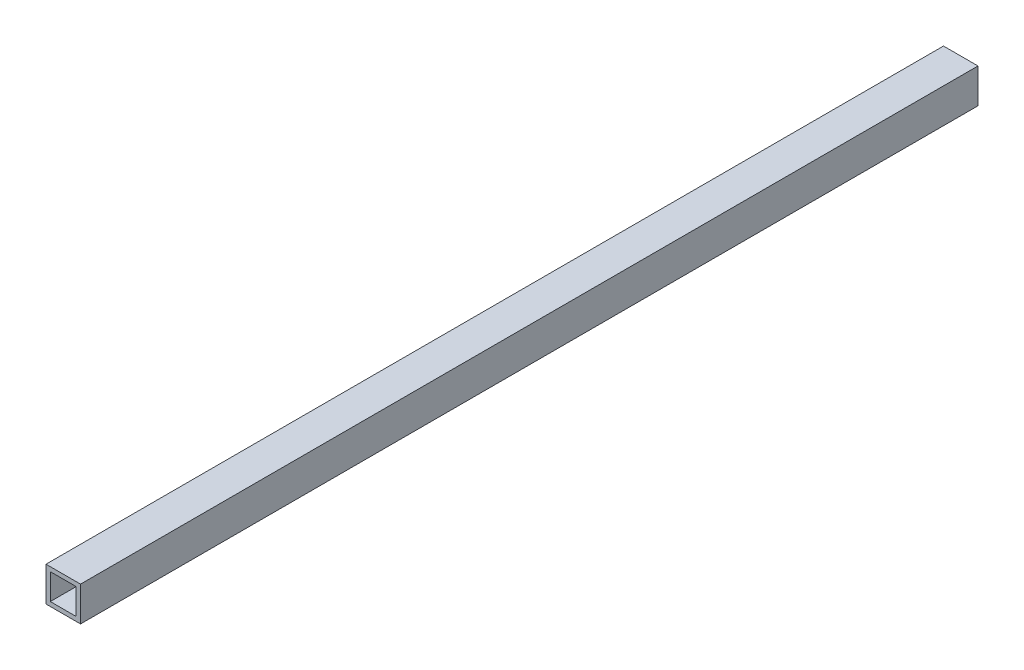
ISO-10303-21;
HEADER;
FILE_DESCRIPTION(('STEP AP214'),'2;1');
FILE_NAME('part.step','',(''),(''),'','','');
FILE_SCHEMA(('AUTOMOTIVE_DESIGN { 1 0 10303 214 1 1 1 1 }'));
ENDSEC;
DATA;
#1=APPLICATION_CONTEXT('core data for automotive mechanical design processes');
#2=APPLICATION_PROTOCOL_DEFINITION('international standard','automotive_design',2000,#1);
#3=PRODUCT_CONTEXT('',#1,'mechanical');
#4=PRODUCT('Part','Part','',(#3));
#5=PRODUCT_RELATED_PRODUCT_CATEGORY('part','',(#4));
#6=PRODUCT_DEFINITION_FORMATION('','',#4);
#7=PRODUCT_DEFINITION_CONTEXT('part definition',#1,'design');
#8=PRODUCT_DEFINITION('design','',#6,#7);
#9=PRODUCT_DEFINITION_SHAPE('','',#8);
#10=(LENGTH_UNIT() NAMED_UNIT(*) SI_UNIT(.MILLI.,.METRE.));
#11=(NAMED_UNIT(*) PLANE_ANGLE_UNIT() SI_UNIT($,.RADIAN.));
#12=(NAMED_UNIT(*) SI_UNIT($,.STERADIAN.) SOLID_ANGLE_UNIT());
#13=UNCERTAINTY_MEASURE_WITH_UNIT(LENGTH_MEASURE(1.E-05),#10,'distance_accuracy_value','');
#14=(GEOMETRIC_REPRESENTATION_CONTEXT(3) GLOBAL_UNCERTAINTY_ASSIGNED_CONTEXT((#13)) GLOBAL_UNIT_ASSIGNED_CONTEXT((#10,
#11,#12)) REPRESENTATION_CONTEXT('',''));
#15=CARTESIAN_POINT('',(0.,0.,0.));
#16=DIRECTION('',(0.,0.,1.));
#17=DIRECTION('',(1.,0.,0.));
#18=AXIS2_PLACEMENT_3D('',#15,#16,#17);
#19=CARTESIAN_POINT('',(0.,0.,330.2));
#20=DIRECTION('',(0.,0.,1.));
#21=DIRECTION('',(1.,0.,0.));
#22=AXIS2_PLACEMENT_3D('',#19,#20,#21);
#23=PLANE('',#22);
#24=DIRECTION('',(0.,-1.,0.));
#25=VECTOR('',#24,1.);
#26=CARTESIAN_POINT('',(-12.7,-12.7,330.2));
#27=LINE('',#26,#25);
#28=CARTESIAN_POINT('',(-12.7,12.7,330.2));
#29=VERTEX_POINT('',#28);
#30=CARTESIAN_POINT('',(-12.7,-12.7,330.2));
#31=VERTEX_POINT('',#30);
#32=EDGE_CURVE('E110',#29,#31,#27,.T.);
#33=ORIENTED_EDGE('',*,*,#32,.T.);
#34=DIRECTION('',(1.,0.,0.));
#35=VECTOR('',#34,1.);
#36=CARTESIAN_POINT('',(12.7,-12.7,330.2));
#37=LINE('',#36,#35);
#38=CARTESIAN_POINT('',(12.7,-12.7,330.2));
#39=VERTEX_POINT('',#38);
#40=EDGE_CURVE('E153',#31,#39,#37,.T.);
#41=ORIENTED_EDGE('',*,*,#40,.T.);
#42=DIRECTION('',(0.,1.,0.));
#43=VECTOR('',#42,1.);
#44=CARTESIAN_POINT('',(12.7,-12.7,330.2));
#45=LINE('',#44,#43);
#46=CARTESIAN_POINT('',(12.7,12.7,330.2));
#47=VERTEX_POINT('',#46);
#48=EDGE_CURVE('E155',#39,#47,#45,.T.);
#49=ORIENTED_EDGE('',*,*,#48,.T.);
#50=DIRECTION('',(-1.,0.,0.));
#51=VECTOR('',#50,1.);
#52=CARTESIAN_POINT('',(12.7,12.7,330.2));
#53=LINE('',#52,#51);
#54=EDGE_CURVE('E57',#47,#29,#53,.T.);
#55=ORIENTED_EDGE('',*,*,#54,.T.);
#56=EDGE_LOOP('',(#33,#41,#49,#55));
#57=FACE_BOUND('',#56,.T.);
#58=DIRECTION('',(1.,0.,0.));
#59=VECTOR('',#58,1.);
#60=CARTESIAN_POINT('',(9.525,-9.525,330.2));
#61=LINE('',#60,#59);
#62=CARTESIAN_POINT('',(-9.52499999999999,-9.525,330.2));
#63=VERTEX_POINT('',#62);
#64=CARTESIAN_POINT('',(9.525,-9.525,330.2));
#65=VERTEX_POINT('',#64);
#66=EDGE_CURVE('E142',#63,#65,#61,.T.);
#67=ORIENTED_EDGE('',*,*,#66,.F.);
#68=DIRECTION('',(0.,-1.,0.));
#69=VECTOR('',#68,1.);
#70=CARTESIAN_POINT('',(-9.52499999999999,-9.525,330.2));
#71=LINE('',#70,#69);
#72=CARTESIAN_POINT('',(-9.52499999999999,9.525,330.2));
#73=VERTEX_POINT('',#72);
#74=EDGE_CURVE('E107',#73,#63,#71,.T.);
#75=ORIENTED_EDGE('',*,*,#74,.F.);
#76=DIRECTION('',(-1.,0.,0.));
#77=VECTOR('',#76,1.);
#78=CARTESIAN_POINT('',(9.525,9.525,330.2));
#79=LINE('',#78,#77);
#80=CARTESIAN_POINT('',(9.525,9.525,330.2));
#81=VERTEX_POINT('',#80);
#82=EDGE_CURVE('E146',#81,#73,#79,.T.);
#83=ORIENTED_EDGE('',*,*,#82,.F.);
#84=DIRECTION('',(0.,1.,0.));
#85=VECTOR('',#84,1.);
#86=CARTESIAN_POINT('',(9.525,-9.525,330.2));
#87=LINE('',#86,#85);
#88=EDGE_CURVE('E144',#65,#81,#87,.T.);
#89=ORIENTED_EDGE('',*,*,#88,.F.);
#90=EDGE_LOOP('',(#67,#75,#83,#89));
#91=FACE_BOUND('',#90,.T.);
#92=ADVANCED_FACE('F34',(#57,#91),#23,.T.);
#93=CARTESIAN_POINT('',(-12.7,-12.7,330.2));
#94=DIRECTION('',(1.,0.,0.));
#95=DIRECTION('',(0.,0.,-1.));
#96=AXIS2_PLACEMENT_3D('',#93,#94,#95);
#97=PLANE('',#96);
#98=DIRECTION('',(0.,0.,-1.));
#99=VECTOR('',#98,1.);
#100=CARTESIAN_POINT('',(-12.7,12.7,330.2));
#101=LINE('',#100,#99);
#102=CARTESIAN_POINT('',(-12.7,12.7,-330.2));
#103=VERTEX_POINT('',#102);
#104=EDGE_CURVE('E158',#29,#103,#101,.T.);
#105=ORIENTED_EDGE('',*,*,#104,.T.);
#106=DIRECTION('',(0.,-1.,0.));
#107=VECTOR('',#106,1.);
#108=CARTESIAN_POINT('',(-12.7,-12.7,-330.2));
#109=LINE('',#108,#107);
#110=CARTESIAN_POINT('',(-12.7,-12.7,-330.2));
#111=VERTEX_POINT('',#110);
#112=EDGE_CURVE('E129',#103,#111,#109,.T.);
#113=ORIENTED_EDGE('',*,*,#112,.T.);
#114=DIRECTION('',(0.,0.,-1.));
#115=VECTOR('',#114,1.);
#116=CARTESIAN_POINT('',(-12.7,-12.7,330.2));
#117=LINE('',#116,#115);
#118=EDGE_CURVE('E11',#31,#111,#117,.T.);
#119=ORIENTED_EDGE('',*,*,#118,.F.);
#120=ORIENTED_EDGE('',*,*,#32,.F.);
#121=EDGE_LOOP('',(#105,#113,#119,#120));
#122=FACE_BOUND('',#121,.T.);
#123=ADVANCED_FACE('F36',(#122),#97,.F.);
#124=CARTESIAN_POINT('',(12.7,-12.7,330.2));
#125=DIRECTION('',(0.,1.,0.));
#126=DIRECTION('',(0.,0.,1.));
#127=AXIS2_PLACEMENT_3D('',#124,#125,#126);
#128=PLANE('',#127);
#129=ORIENTED_EDGE('',*,*,#118,.T.);
#130=DIRECTION('',(1.,0.,0.));
#131=VECTOR('',#130,1.);
#132=CARTESIAN_POINT('',(12.7,-12.7,-330.2));
#133=LINE('',#132,#131);
#134=CARTESIAN_POINT('',(12.7,-12.7,-330.2));
#135=VERTEX_POINT('',#134);
#136=EDGE_CURVE('E132',#111,#135,#133,.T.);
#137=ORIENTED_EDGE('',*,*,#136,.T.);
#138=DIRECTION('',(0.,0.,-1.));
#139=VECTOR('',#138,1.);
#140=CARTESIAN_POINT('',(12.7,-12.7,330.2));
#141=LINE('',#140,#139);
#142=EDGE_CURVE('E42',#39,#135,#141,.T.);
#143=ORIENTED_EDGE('',*,*,#142,.F.);
#144=ORIENTED_EDGE('',*,*,#40,.F.);
#145=EDGE_LOOP('',(#129,#137,#143,#144));
#146=FACE_BOUND('',#145,.T.);
#147=ADVANCED_FACE('F171',(#146),#128,.F.);
#148=CARTESIAN_POINT('',(12.7,-12.7,330.2));
#149=DIRECTION('',(-1.,0.,0.));
#150=DIRECTION('',(0.,0.,1.));
#151=AXIS2_PLACEMENT_3D('',#148,#149,#150);
#152=PLANE('',#151);
#153=ORIENTED_EDGE('',*,*,#142,.T.);
#154=DIRECTION('',(0.,1.,0.));
#155=VECTOR('',#154,1.);
#156=CARTESIAN_POINT('',(12.7,-12.7,-330.2));
#157=LINE('',#156,#155);
#158=CARTESIAN_POINT('',(12.7,12.7,-330.2));
#159=VERTEX_POINT('',#158);
#160=EDGE_CURVE('E135',#135,#159,#157,.T.);
#161=ORIENTED_EDGE('',*,*,#160,.T.);
#162=DIRECTION('',(0.,0.,-1.));
#163=VECTOR('',#162,1.);
#164=CARTESIAN_POINT('',(12.7,12.7,330.2));
#165=LINE('',#164,#163);
#166=EDGE_CURVE('E160',#47,#159,#165,.T.);
#167=ORIENTED_EDGE('',*,*,#166,.F.);
#168=ORIENTED_EDGE('',*,*,#48,.F.);
#169=EDGE_LOOP('',(#153,#161,#167,#168));
#170=FACE_BOUND('',#169,.T.);
#171=ADVANCED_FACE('F165',(#170),#152,.F.);
#172=CARTESIAN_POINT('',(12.7,12.7,330.2));
#173=DIRECTION('',(0.,-1.,0.));
#174=DIRECTION('',(0.,0.,-1.));
#175=AXIS2_PLACEMENT_3D('',#172,#173,#174);
#176=PLANE('',#175);
#177=ORIENTED_EDGE('',*,*,#166,.T.);
#178=DIRECTION('',(-1.,0.,0.));
#179=VECTOR('',#178,1.);
#180=CARTESIAN_POINT('',(12.7,12.7,-330.2));
#181=LINE('',#180,#179);
#182=EDGE_CURVE('E138',#159,#103,#181,.T.);
#183=ORIENTED_EDGE('',*,*,#182,.T.);
#184=ORIENTED_EDGE('',*,*,#104,.F.);
#185=ORIENTED_EDGE('',*,*,#54,.F.);
#186=EDGE_LOOP('',(#177,#183,#184,#185));
#187=FACE_BOUND('',#186,.T.);
#188=ADVANCED_FACE('F176',(#187),#176,.F.);
#189=CARTESIAN_POINT('',(-9.52499999999999,-9.525,330.2));
#190=DIRECTION('',(1.,0.,0.));
#191=DIRECTION('',(0.,0.,-1.));
#192=AXIS2_PLACEMENT_3D('',#189,#190,#191);
#193=PLANE('',#192);
#194=DIRECTION('',(0.,0.,-1.));
#195=VECTOR('',#194,1.);
#196=CARTESIAN_POINT('',(-9.52499999999999,-9.525,330.2));
#197=LINE('',#196,#195);
#198=CARTESIAN_POINT('',(-9.52499999999999,-9.525,-330.2));
#199=VERTEX_POINT('',#198);
#200=EDGE_CURVE('E99',#63,#199,#197,.T.);
#201=ORIENTED_EDGE('',*,*,#200,.T.);
#202=DIRECTION('',(0.,-1.,0.));
#203=VECTOR('',#202,1.);
#204=CARTESIAN_POINT('',(-9.52499999999999,-9.525,-330.2));
#205=LINE('',#204,#203);
#206=CARTESIAN_POINT('',(-9.52499999999999,9.525,-330.2));
#207=VERTEX_POINT('',#206);
#208=EDGE_CURVE('E104',#207,#199,#205,.T.);
#209=ORIENTED_EDGE('',*,*,#208,.F.);
#210=DIRECTION('',(0.,0.,-1.));
#211=VECTOR('',#210,1.);
#212=CARTESIAN_POINT('',(-9.52499999999999,9.525,330.2));
#213=LINE('',#212,#211);
#214=EDGE_CURVE('E148',#73,#207,#213,.T.);
#215=ORIENTED_EDGE('',*,*,#214,.F.);
#216=ORIENTED_EDGE('',*,*,#74,.T.);
#217=EDGE_LOOP('',(#201,#209,#215,#216));
#218=FACE_BOUND('',#217,.T.);
#219=ADVANCED_FACE('F101',(#218),#193,.T.);
#220=CARTESIAN_POINT('',(9.525,-9.525,330.2));
#221=DIRECTION('',(0.,1.,0.));
#222=DIRECTION('',(0.,0.,1.));
#223=AXIS2_PLACEMENT_3D('',#220,#221,#222);
#224=PLANE('',#223);
#225=DIRECTION('',(0.,0.,-1.));
#226=VECTOR('',#225,1.);
#227=CARTESIAN_POINT('',(9.525,-9.525,330.2));
#228=LINE('',#227,#226);
#229=CARTESIAN_POINT('',(9.525,-9.525,-330.2));
#230=VERTEX_POINT('',#229);
#231=EDGE_CURVE('E111',#65,#230,#228,.T.);
#232=ORIENTED_EDGE('',*,*,#231,.T.);
#233=DIRECTION('',(1.,0.,0.));
#234=VECTOR('',#233,1.);
#235=CARTESIAN_POINT('',(9.525,-9.525,-330.2));
#236=LINE('',#235,#234);
#237=EDGE_CURVE('E114',#199,#230,#236,.T.);
#238=ORIENTED_EDGE('',*,*,#237,.F.);
#239=ORIENTED_EDGE('',*,*,#200,.F.);
#240=ORIENTED_EDGE('',*,*,#66,.T.);
#241=EDGE_LOOP('',(#232,#238,#239,#240));
#242=FACE_BOUND('',#241,.T.);
#243=ADVANCED_FACE('F115',(#242),#224,.T.);
#244=CARTESIAN_POINT('',(9.525,-9.525,330.2));
#245=DIRECTION('',(-1.,0.,0.));
#246=DIRECTION('',(0.,0.,1.));
#247=AXIS2_PLACEMENT_3D('',#244,#245,#246);
#248=PLANE('',#247);
#249=DIRECTION('',(0.,0.,-1.));
#250=VECTOR('',#249,1.);
#251=CARTESIAN_POINT('',(9.525,9.525,330.2));
#252=LINE('',#251,#250);
#253=CARTESIAN_POINT('',(9.525,9.525,-330.2));
#254=VERTEX_POINT('',#253);
#255=EDGE_CURVE('E49',#81,#254,#252,.T.);
#256=ORIENTED_EDGE('',*,*,#255,.T.);
#257=DIRECTION('',(0.,1.,0.));
#258=VECTOR('',#257,1.);
#259=CARTESIAN_POINT('',(9.525,-9.525,-330.2));
#260=LINE('',#259,#258);
#261=EDGE_CURVE('E120',#230,#254,#260,.T.);
#262=ORIENTED_EDGE('',*,*,#261,.F.);
#263=ORIENTED_EDGE('',*,*,#231,.F.);
#264=ORIENTED_EDGE('',*,*,#88,.T.);
#265=EDGE_LOOP('',(#256,#262,#263,#264));
#266=FACE_BOUND('',#265,.T.);
#267=ADVANCED_FACE('F194',(#266),#248,.T.);
#268=CARTESIAN_POINT('',(9.525,9.525,330.2));
#269=DIRECTION('',(0.,-1.,0.));
#270=DIRECTION('',(0.,0.,-1.));
#271=AXIS2_PLACEMENT_3D('',#268,#269,#270);
#272=PLANE('',#271);
#273=ORIENTED_EDGE('',*,*,#214,.T.);
#274=DIRECTION('',(-1.,0.,0.));
#275=VECTOR('',#274,1.);
#276=CARTESIAN_POINT('',(9.525,9.525,-330.2));
#277=LINE('',#276,#275);
#278=EDGE_CURVE('E124',#254,#207,#277,.T.);
#279=ORIENTED_EDGE('',*,*,#278,.F.);
#280=ORIENTED_EDGE('',*,*,#255,.F.);
#281=ORIENTED_EDGE('',*,*,#82,.T.);
#282=EDGE_LOOP('',(#273,#279,#280,#281));
#283=FACE_BOUND('',#282,.T.);
#284=ADVANCED_FACE('F197',(#283),#272,.T.);
#285=CARTESIAN_POINT('',(0.,0.,-330.2));
#286=DIRECTION('',(0.,0.,1.));
#287=DIRECTION('',(1.,0.,0.));
#288=AXIS2_PLACEMENT_3D('',#285,#286,#287);
#289=PLANE('',#288);
#290=ORIENTED_EDGE('',*,*,#278,.T.);
#291=ORIENTED_EDGE('',*,*,#208,.T.);
#292=ORIENTED_EDGE('',*,*,#237,.T.);
#293=ORIENTED_EDGE('',*,*,#261,.T.);
#294=EDGE_LOOP('',(#290,#291,#292,#293));
#295=FACE_BOUND('',#294,.T.);
#296=ORIENTED_EDGE('',*,*,#112,.F.);
#297=ORIENTED_EDGE('',*,*,#182,.F.);
#298=ORIENTED_EDGE('',*,*,#160,.F.);
#299=ORIENTED_EDGE('',*,*,#136,.F.);
#300=EDGE_LOOP('',(#296,#297,#298,#299));
#301=FACE_BOUND('',#300,.T.);
#302=ADVANCED_FACE('F122',(#295,#301),#289,.F.);
#303=CLOSED_SHELL('',(#92,#123,#147,#171,#188,#219,#243,#267,#284,#302));
#304=MANIFOLD_SOLID_BREP('B2',#303);
#305=ADVANCED_BREP_SHAPE_REPRESENTATION('',(#18,#304),#14);
#306=SHAPE_DEFINITION_REPRESENTATION(#9,#305);
ENDSEC;
END-ISO-10303-21;
